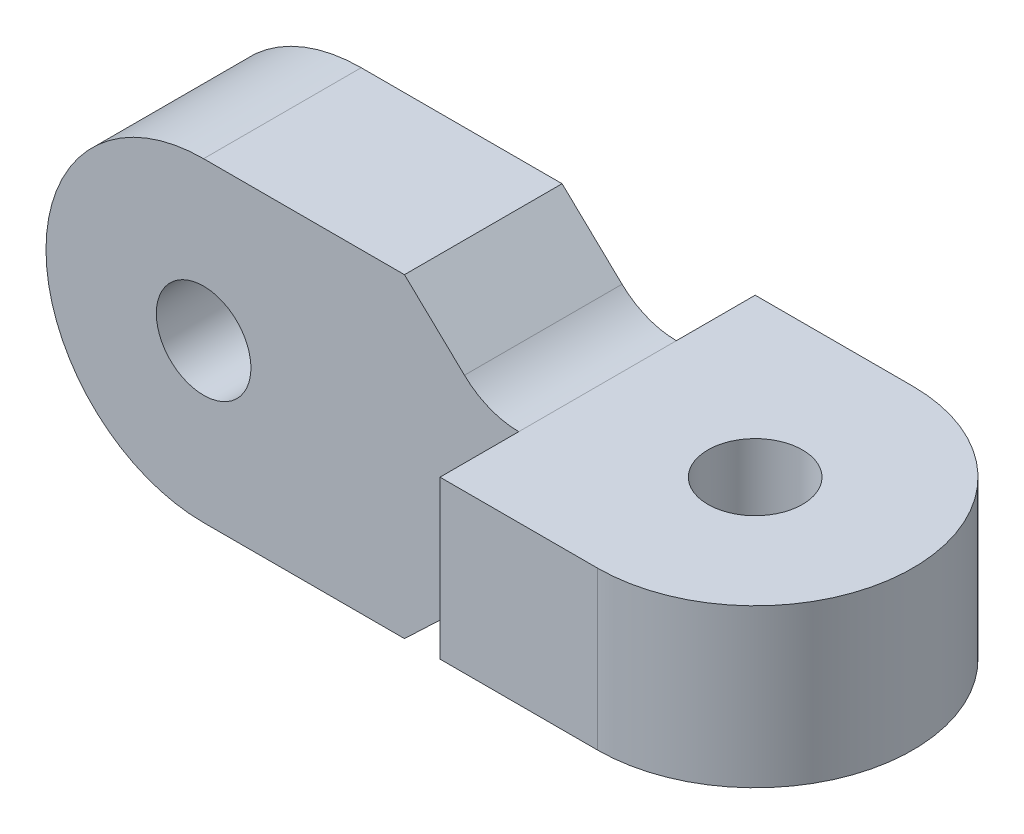
ISO-10303-21;
HEADER;
FILE_DESCRIPTION(('STEP AP214'),'2;1');
FILE_NAME('part.step','',(''),(''),'','','');
FILE_SCHEMA(('AUTOMOTIVE_DESIGN { 1 0 10303 214 1 1 1 1 }'));
ENDSEC;
DATA;
#1=APPLICATION_CONTEXT('core data for automotive mechanical design processes');
#2=APPLICATION_PROTOCOL_DEFINITION('international standard','automotive_design',2000,#1);
#3=PRODUCT_CONTEXT('',#1,'mechanical');
#4=PRODUCT('Part','Part','',(#3));
#5=PRODUCT_RELATED_PRODUCT_CATEGORY('part','',(#4));
#6=PRODUCT_DEFINITION_FORMATION('','',#4);
#7=PRODUCT_DEFINITION_CONTEXT('part definition',#1,'design');
#8=PRODUCT_DEFINITION('design','',#6,#7);
#9=PRODUCT_DEFINITION_SHAPE('','',#8);
#10=(LENGTH_UNIT() NAMED_UNIT(*) SI_UNIT(.MILLI.,.METRE.));
#11=(NAMED_UNIT(*) PLANE_ANGLE_UNIT() SI_UNIT($,.RADIAN.));
#12=(NAMED_UNIT(*) SI_UNIT($,.STERADIAN.) SOLID_ANGLE_UNIT());
#13=UNCERTAINTY_MEASURE_WITH_UNIT(LENGTH_MEASURE(1.E-05),#10,'distance_accuracy_value','');
#14=(GEOMETRIC_REPRESENTATION_CONTEXT(3) GLOBAL_UNCERTAINTY_ASSIGNED_CONTEXT((#13)) GLOBAL_UNIT_ASSIGNED_CONTEXT((#10,
#11,#12)) REPRESENTATION_CONTEXT('',''));
#15=CARTESIAN_POINT('',(0.,0.,0.));
#16=DIRECTION('',(0.,0.,1.));
#17=DIRECTION('',(1.,0.,0.));
#18=AXIS2_PLACEMENT_3D('',#15,#16,#17);
#19=CARTESIAN_POINT('',(0.,0.,10.));
#20=DIRECTION('',(0.,0.,-1.));
#21=DIRECTION('',(-1.,0.,0.));
#22=AXIS2_PLACEMENT_3D('',#19,#20,#21);
#23=PLANE('',#22);
#24=DIRECTION('',(-1.,0.,0.));
#25=VECTOR('',#24,1.);
#26=CARTESIAN_POINT('',(25.,7.5,10.));
#27=LINE('',#26,#25);
#28=CARTESIAN_POINT('',(20.,7.5,10.));
#29=VERTEX_POINT('',#28);
#30=CARTESIAN_POINT('',(15.,7.5,10.));
#31=VERTEX_POINT('',#30);
#32=EDGE_CURVE('E197',#29,#31,#27,.T.);
#33=ORIENTED_EDGE('',*,*,#32,.T.);
#34=DIRECTION('',(0.,-1.,0.));
#35=VECTOR('',#34,1.);
#36=CARTESIAN_POINT('',(15.,0.,10.));
#37=LINE('',#36,#35);
#38=CARTESIAN_POINT('',(15.,2.5,10.));
#39=VERTEX_POINT('',#38);
#40=EDGE_CURVE('E160',#31,#39,#37,.T.);
#41=ORIENTED_EDGE('',*,*,#40,.T.);
#42=DIRECTION('',(1.,0.,0.));
#43=VECTOR('',#42,1.);
#44=CARTESIAN_POINT('',(25.,2.5,10.));
#45=LINE('',#44,#43);
#46=CARTESIAN_POINT('',(20.,2.5,10.));
#47=VERTEX_POINT('',#46);
#48=EDGE_CURVE('E194',#39,#47,#45,.T.);
#49=ORIENTED_EDGE('',*,*,#48,.T.);
#50=DIRECTION('',(0.,1.,0.));
#51=VECTOR('',#50,1.);
#52=CARTESIAN_POINT('',(20.,-2.5,10.));
#53=LINE('',#52,#51);
#54=EDGE_CURVE('E179',#47,#29,#53,.T.);
#55=ORIENTED_EDGE('',*,*,#54,.T.);
#56=EDGE_LOOP('',(#33,#41,#49,#55));
#57=FACE_BOUND('',#56,.T.);
#58=ADVANCED_FACE('F32',(#57),#23,.F.);
#59=CARTESIAN_POINT('',(0.,0.,0.));
#60=DIRECTION('',(0.,0.,-1.));
#61=DIRECTION('',(-1.,0.,0.));
#62=AXIS2_PLACEMENT_3D('',#59,#60,#61);
#63=PLANE('',#62);
#64=DIRECTION('',(0.,-1.,0.));
#65=VECTOR('',#64,1.);
#66=CARTESIAN_POINT('',(15.,0.,0.));
#67=LINE('',#66,#65);
#68=CARTESIAN_POINT('',(15.,7.5,0.));
#69=VERTEX_POINT('',#68);
#70=CARTESIAN_POINT('',(15.,2.5,0.));
#71=VERTEX_POINT('',#70);
#72=EDGE_CURVE('E174',#69,#71,#67,.T.);
#73=ORIENTED_EDGE('',*,*,#72,.F.);
#74=DIRECTION('',(-1.,0.,0.));
#75=VECTOR('',#74,1.);
#76=CARTESIAN_POINT('',(25.,7.5,0.));
#77=LINE('',#76,#75);
#78=CARTESIAN_POINT('',(20.,7.5,0.));
#79=VERTEX_POINT('',#78);
#80=EDGE_CURVE('E198',#79,#69,#77,.T.);
#81=ORIENTED_EDGE('',*,*,#80,.F.);
#82=DIRECTION('',(0.,1.,0.));
#83=VECTOR('',#82,1.);
#84=CARTESIAN_POINT('',(20.,-2.5,0.));
#85=LINE('',#84,#83);
#86=CARTESIAN_POINT('',(20.,2.5,0.));
#87=VERTEX_POINT('',#86);
#88=EDGE_CURVE('E180',#87,#79,#85,.T.);
#89=ORIENTED_EDGE('',*,*,#88,.F.);
#90=DIRECTION('',(1.,0.,0.));
#91=VECTOR('',#90,1.);
#92=CARTESIAN_POINT('',(25.,2.5,0.));
#93=LINE('',#92,#91);
#94=EDGE_CURVE('E193',#71,#87,#93,.T.);
#95=ORIENTED_EDGE('',*,*,#94,.F.);
#96=EDGE_LOOP('',(#73,#81,#89,#95));
#97=FACE_BOUND('',#96,.T.);
#98=ADVANCED_FACE('F289',(#97),#63,.T.);
#99=CARTESIAN_POINT('',(0.,0.,10.));
#100=DIRECTION('',(0.,1.,0.));
#101=DIRECTION('',(0.,0.,1.));
#102=AXIS2_PLACEMENT_3D('',#99,#100,#101);
#103=PLANE('',#102);
#104=DIRECTION('',(1.,0.,0.));
#105=VECTOR('',#104,1.);
#106=CARTESIAN_POINT('',(-15.,0.,2.5));
#107=LINE('',#106,#105);
#108=CARTESIAN_POINT('',(5.,0.,2.5));
#109=VERTEX_POINT('',#108);
#110=CARTESIAN_POINT('',(11.3734309656961,0.,2.5));
#111=VERTEX_POINT('',#110);
#112=EDGE_CURVE('E141',#109,#111,#107,.T.);
#113=ORIENTED_EDGE('',*,*,#112,.T.);
#114=DIRECTION('',(0.,0.,1.));
#115=VECTOR('',#114,1.);
#116=CARTESIAN_POINT('',(11.3734309656961,0.,-2.5));
#117=LINE('',#116,#115);
#118=CARTESIAN_POINT('',(11.3734309656961,0.,7.5));
#119=VERTEX_POINT('',#118);
#120=EDGE_CURVE('E129',#111,#119,#117,.T.);
#121=ORIENTED_EDGE('',*,*,#120,.T.);
#122=DIRECTION('',(-1.,0.,0.));
#123=VECTOR('',#122,1.);
#124=CARTESIAN_POINT('',(-15.,0.,7.5));
#125=LINE('',#124,#123);
#126=CARTESIAN_POINT('',(5.,0.,7.5));
#127=VERTEX_POINT('',#126);
#128=EDGE_CURVE('E138',#119,#127,#125,.T.);
#129=ORIENTED_EDGE('',*,*,#128,.T.);
#130=DIRECTION('',(0.,0.,-1.));
#131=VECTOR('',#130,1.);
#132=CARTESIAN_POINT('',(5.,0.,10.));
#133=LINE('',#132,#131);
#134=EDGE_CURVE('E215',#127,#109,#133,.T.);
#135=ORIENTED_EDGE('',*,*,#134,.T.);
#136=EDGE_LOOP('',(#113,#121,#129,#135));
#137=FACE_BOUND('',#136,.T.);
#138=ADVANCED_FACE('F136',(#137),#103,.F.);
#139=CARTESIAN_POINT('',(25.,2.5,10.));
#140=DIRECTION('',(0.,1.,0.));
#141=DIRECTION('',(-1.,0.,0.));
#142=AXIS2_PLACEMENT_3D('',#139,#140,#141);
#143=PLANE('',#142);
#144=CARTESIAN_POINT('',(20.,2.5,5.));
#145=DIRECTION('',(0.,1.,0.));
#146=DIRECTION('',(-1.,0.,0.));
#147=AXIS2_PLACEMENT_3D('',#144,#145,#146);
#148=CIRCLE('',#147,1.5);
#149=CARTESIAN_POINT('',(18.5,2.5,5.));
#150=VERTEX_POINT('',#149);
#151=EDGE_CURVE('E190',#150,#150,#148,.T.);
#152=ORIENTED_EDGE('',*,*,#151,.T.);
#153=EDGE_LOOP('',(#152));
#154=FACE_BOUND('',#153,.T.);
#155=ORIENTED_EDGE('',*,*,#94,.T.);
#156=CARTESIAN_POINT('',(20.,2.5,5.));
#157=DIRECTION('',(0.,1.,0.));
#158=DIRECTION('',(-1.,0.,0.));
#159=AXIS2_PLACEMENT_3D('',#156,#157,#158);
#160=CIRCLE('',#159,5.);
#161=EDGE_CURVE('E183',#87,#47,#160,.F.);
#162=ORIENTED_EDGE('',*,*,#161,.T.);
#163=ORIENTED_EDGE('',*,*,#48,.F.);
#164=DIRECTION('',(0.,0.,-1.));
#165=VECTOR('',#164,1.);
#166=CARTESIAN_POINT('',(15.,2.5,10.));
#167=LINE('',#166,#165);
#168=CARTESIAN_POINT('',(15.,2.50000000000001,7.5));
#169=VERTEX_POINT('',#168);
#170=EDGE_CURVE('E210',#39,#169,#167,.T.);
#171=ORIENTED_EDGE('',*,*,#170,.T.);
#172=CARTESIAN_POINT('',(15.,2.50000000000001,2.5));
#173=VERTEX_POINT('',#172);
#174=EDGE_CURVE('E209',#169,#173,#167,.T.);
#175=ORIENTED_EDGE('',*,*,#174,.T.);
#176=DIRECTION('',(0.,0.,-1.));
#177=VECTOR('',#176,1.);
#178=CARTESIAN_POINT('',(15.,2.5,10.));
#179=LINE('',#178,#177);
#180=EDGE_CURVE('E176',#173,#71,#179,.T.);
#181=ORIENTED_EDGE('',*,*,#180,.T.);
#182=EDGE_LOOP('',(#155,#162,#163,#171,#175,#181));
#183=FACE_BOUND('',#182,.T.);
#184=ADVANCED_FACE('F261',(#154,#183),#143,.F.);
#185=CARTESIAN_POINT('',(25.,7.5,10.));
#186=DIRECTION('',(0.,-1.,0.));
#187=DIRECTION('',(0.,0.,-1.));
#188=AXIS2_PLACEMENT_3D('',#185,#186,#187);
#189=PLANE('',#188);
#190=CARTESIAN_POINT('',(20.,7.5,5.));
#191=DIRECTION('',(0.,1.,0.));
#192=DIRECTION('',(0.,0.,1.));
#193=AXIS2_PLACEMENT_3D('',#190,#191,#192);
#194=CIRCLE('',#193,1.5);
#195=CARTESIAN_POINT('',(20.,7.5,6.5));
#196=VERTEX_POINT('',#195);
#197=EDGE_CURVE('E187',#196,#196,#194,.T.);
#198=ORIENTED_EDGE('',*,*,#197,.F.);
#199=EDGE_LOOP('',(#198));
#200=FACE_BOUND('',#199,.T.);
#201=ORIENTED_EDGE('',*,*,#32,.F.);
#202=CARTESIAN_POINT('',(20.,7.5,5.));
#203=DIRECTION('',(0.,-1.,0.));
#204=DIRECTION('',(0.,0.,-1.));
#205=AXIS2_PLACEMENT_3D('',#202,#203,#204);
#206=CIRCLE('',#205,5.);
#207=EDGE_CURVE('E213',#29,#79,#206,.F.);
#208=ORIENTED_EDGE('',*,*,#207,.T.);
#209=ORIENTED_EDGE('',*,*,#80,.T.);
#210=DIRECTION('',(0.,0.,1.));
#211=VECTOR('',#210,1.);
#212=CARTESIAN_POINT('',(15.,7.5,10.));
#213=LINE('',#212,#211);
#214=CARTESIAN_POINT('',(15.,7.5,2.5));
#215=VERTEX_POINT('',#214);
#216=EDGE_CURVE('E171',#69,#215,#213,.T.);
#217=ORIENTED_EDGE('',*,*,#216,.T.);
#218=DIRECTION('',(0.,0.,-1.));
#219=VECTOR('',#218,1.);
#220=CARTESIAN_POINT('',(15.,7.5,10.));
#221=LINE('',#220,#219);
#222=CARTESIAN_POINT('',(15.,7.5,7.5));
#223=VERTEX_POINT('',#222);
#224=EDGE_CURVE('E201',#223,#215,#221,.T.);
#225=ORIENTED_EDGE('',*,*,#224,.F.);
#226=EDGE_CURVE('E206',#31,#223,#221,.T.);
#227=ORIENTED_EDGE('',*,*,#226,.F.);
#228=EDGE_LOOP('',(#201,#208,#209,#217,#225,#227));
#229=FACE_BOUND('',#228,.T.);
#230=ADVANCED_FACE('F267',(#200,#229),#189,.F.);
#231=CARTESIAN_POINT('',(0.,10.,10.));
#232=DIRECTION('',(0.,-1.,0.));
#233=DIRECTION('',(0.,0.,-1.));
#234=AXIS2_PLACEMENT_3D('',#231,#232,#233);
#235=PLANE('',#234);
#236=DIRECTION('',(-1.,0.,0.));
#237=VECTOR('',#236,1.);
#238=CARTESIAN_POINT('',(-15.,10.,7.5));
#239=LINE('',#238,#237);
#240=CARTESIAN_POINT('',(11.3734309656961,10.,7.5));
#241=VERTEX_POINT('',#240);
#242=CARTESIAN_POINT('',(5.,10.,7.5));
#243=VERTEX_POINT('',#242);
#244=EDGE_CURVE('E149',#241,#243,#239,.T.);
#245=ORIENTED_EDGE('',*,*,#244,.F.);
#246=DIRECTION('',(0.,0.,1.));
#247=VECTOR('',#246,1.);
#248=CARTESIAN_POINT('',(11.3734309656961,10.,-2.5));
#249=LINE('',#248,#247);
#250=CARTESIAN_POINT('',(11.3734309656961,10.,2.5));
#251=VERTEX_POINT('',#250);
#252=EDGE_CURVE('E55',#251,#241,#249,.T.);
#253=ORIENTED_EDGE('',*,*,#252,.F.);
#254=DIRECTION('',(1.,0.,0.));
#255=VECTOR('',#254,1.);
#256=CARTESIAN_POINT('',(-15.,10.,2.5));
#257=LINE('',#256,#255);
#258=CARTESIAN_POINT('',(5.,10.,2.5));
#259=VERTEX_POINT('',#258);
#260=EDGE_CURVE('E163',#259,#251,#257,.T.);
#261=ORIENTED_EDGE('',*,*,#260,.F.);
#262=DIRECTION('',(0.,0.,-1.));
#263=VECTOR('',#262,1.);
#264=CARTESIAN_POINT('',(5.,10.,10.));
#265=LINE('',#264,#263);
#266=EDGE_CURVE('E40',#259,#243,#265,.F.);
#267=ORIENTED_EDGE('',*,*,#266,.T.);
#268=EDGE_LOOP('',(#245,#253,#261,#267));
#269=FACE_BOUND('',#268,.T.);
#270=ADVANCED_FACE('F273',(#269),#235,.F.);
#271=CARTESIAN_POINT('',(5.,5.,10.));
#272=DIRECTION('',(0.,0.,-1.));
#273=DIRECTION('',(-1.,0.,0.));
#274=AXIS2_PLACEMENT_3D('',#271,#272,#273);
#275=CYLINDRICAL_SURFACE('',#274,1.5);
#276=CARTESIAN_POINT('',(5.,5.,7.5));
#277=DIRECTION('',(0.,0.,-1.));
#278=DIRECTION('',(-1.,0.,0.));
#279=AXIS2_PLACEMENT_3D('',#276,#277,#278);
#280=CIRCLE('',#279,1.5);
#281=CARTESIAN_POINT('',(3.5,5.,7.5));
#282=VERTEX_POINT('',#281);
#283=EDGE_CURVE('E152',#282,#282,#280,.T.);
#284=ORIENTED_EDGE('',*,*,#283,.F.);
#285=EDGE_LOOP('',(#284));
#286=FACE_BOUND('',#285,.T.);
#287=CARTESIAN_POINT('',(5.,5.,2.5));
#288=DIRECTION('',(0.,0.,1.));
#289=DIRECTION('',(1.,0.,0.));
#290=AXIS2_PLACEMENT_3D('',#287,#288,#289);
#291=CIRCLE('',#290,1.5);
#292=CARTESIAN_POINT('',(6.5,5.,2.5));
#293=VERTEX_POINT('',#292);
#294=EDGE_CURVE('E170',#293,#293,#291,.T.);
#295=ORIENTED_EDGE('',*,*,#294,.F.);
#296=EDGE_LOOP('',(#295));
#297=FACE_BOUND('',#296,.T.);
#298=ADVANCED_FACE('F297',(#286,#297),#275,.F.);
#299=CARTESIAN_POINT('',(20.,-2.5,5.));
#300=DIRECTION('',(0.,1.,0.));
#301=DIRECTION('',(0.,0.,1.));
#302=AXIS2_PLACEMENT_3D('',#299,#300,#301);
#303=CYLINDRICAL_SURFACE('',#302,1.5);
#304=ORIENTED_EDGE('',*,*,#197,.T.);
#305=EDGE_LOOP('',(#304));
#306=FACE_BOUND('',#305,.T.);
#307=ORIENTED_EDGE('',*,*,#151,.F.);
#308=EDGE_LOOP('',(#307));
#309=FACE_BOUND('',#308,.T.);
#310=ADVANCED_FACE('F331',(#306,#309),#303,.F.);
#311=CARTESIAN_POINT('',(20.,-2.5,5.));
#312=DIRECTION('',(0.,1.,0.));
#313=DIRECTION('',(0.,0.,1.));
#314=AXIS2_PLACEMENT_3D('',#311,#312,#313);
#315=CYLINDRICAL_SURFACE('',#314,5.);
#316=ORIENTED_EDGE('',*,*,#88,.T.);
#317=ORIENTED_EDGE('',*,*,#207,.F.);
#318=ORIENTED_EDGE('',*,*,#54,.F.);
#319=ORIENTED_EDGE('',*,*,#161,.F.);
#320=EDGE_LOOP('',(#316,#317,#318,#319));
#321=FACE_BOUND('',#320,.T.);
#322=ADVANCED_FACE('F339',(#321),#315,.T.);
#323=CARTESIAN_POINT('',(15.,0.,2.5));
#324=DIRECTION('',(1.,0.,0.));
#325=DIRECTION('',(0.,0.,-1.));
#326=AXIS2_PLACEMENT_3D('',#323,#324,#325);
#327=PLANE('',#326);
#328=DIRECTION('',(0.,1.,0.));
#329=VECTOR('',#328,1.);
#330=CARTESIAN_POINT('',(15.,0.,2.5));
#331=LINE('',#330,#329);
#332=EDGE_CURVE('E165',#173,#215,#331,.T.);
#333=ORIENTED_EDGE('',*,*,#332,.T.);
#334=ORIENTED_EDGE('',*,*,#216,.F.);
#335=ORIENTED_EDGE('',*,*,#72,.T.);
#336=ORIENTED_EDGE('',*,*,#180,.F.);
#337=EDGE_LOOP('',(#333,#334,#335,#336));
#338=FACE_BOUND('',#337,.T.);
#339=ADVANCED_FACE('F346',(#338),#327,.F.);
#340=CARTESIAN_POINT('',(-15.,0.,2.5));
#341=DIRECTION('',(0.,0.,1.));
#342=DIRECTION('',(1.,0.,0.));
#343=AXIS2_PLACEMENT_3D('',#340,#341,#342);
#344=PLANE('',#343);
#345=ORIENTED_EDGE('',*,*,#294,.T.);
#346=EDGE_LOOP('',(#345));
#347=FACE_BOUND('',#346,.T.);
#348=ORIENTED_EDGE('',*,*,#332,.F.);
#349=CARTESIAN_POINT('',(15.,0.,2.5));
#350=DIRECTION('',(0.,0.,1.));
#351=DIRECTION('',(1.,0.,0.));
#352=AXIS2_PLACEMENT_3D('',#349,#350,#351);
#353=CIRCLE('',#352,2.50000000000001);
#354=CARTESIAN_POINT('',(13.2766080168664,1.8110549611954,2.5));
#355=VERTEX_POINT('',#354);
#356=EDGE_CURVE('E245',#173,#355,#353,.T.);
#357=ORIENTED_EDGE('',*,*,#356,.T.);
#358=DIRECTION('',(-0.724421984478188,-0.689356793253453,0.));
#359=VECTOR('',#358,1.);
#360=CARTESIAN_POINT('',(-2.46700833099307,-13.1705015242702,2.5));
#361=LINE('',#360,#359);
#362=EDGE_CURVE('E142',#355,#111,#361,.T.);
#363=ORIENTED_EDGE('',*,*,#362,.T.);
#364=ORIENTED_EDGE('',*,*,#112,.F.);
#365=CARTESIAN_POINT('',(5.,5.,2.5));
#366=DIRECTION('',(0.,0.,1.));
#367=DIRECTION('',(1.,0.,0.));
#368=AXIS2_PLACEMENT_3D('',#365,#366,#367);
#369=CIRCLE('',#368,5.);
#370=CARTESIAN_POINT('',(0.,5.,2.5));
#371=VERTEX_POINT('',#370);
#372=EDGE_CURVE('E223',#109,#371,#369,.F.);
#373=ORIENTED_EDGE('',*,*,#372,.T.);
#374=CARTESIAN_POINT('',(5.,5.,2.5));
#375=DIRECTION('',(0.,0.,1.));
#376=DIRECTION('',(1.,0.,0.));
#377=AXIS2_PLACEMENT_3D('',#374,#375,#376);
#378=CIRCLE('',#377,5.);
#379=EDGE_CURVE('E221',#371,#259,#378,.F.);
#380=ORIENTED_EDGE('',*,*,#379,.T.);
#381=ORIENTED_EDGE('',*,*,#260,.T.);
#382=DIRECTION('',(0.724421984478188,-0.689356793253453,0.));
#383=VECTOR('',#382,1.);
#384=CARTESIAN_POINT('',(2.52684383082876,18.4183736402233,2.5));
#385=LINE('',#384,#383);
#386=CARTESIAN_POINT('',(13.2766080168664,8.18894503880453,2.5));
#387=VERTEX_POINT('',#386);
#388=EDGE_CURVE('E233',#251,#387,#385,.T.);
#389=ORIENTED_EDGE('',*,*,#388,.T.);
#390=CARTESIAN_POINT('',(15.,10.,2.5));
#391=DIRECTION('',(0.,0.,1.));
#392=DIRECTION('',(1.,0.,0.));
#393=AXIS2_PLACEMENT_3D('',#390,#391,#392);
#394=CIRCLE('',#393,2.5);
#395=EDGE_CURVE('E157',#387,#215,#394,.T.);
#396=ORIENTED_EDGE('',*,*,#395,.T.);
#397=EDGE_LOOP('',(#348,#357,#363,#364,#373,#380,#381,#389,#396));
#398=FACE_BOUND('',#397,.T.);
#399=ADVANCED_FACE('F249',(#347,#398),#344,.F.);
#400=CARTESIAN_POINT('',(15.,0.,12.9541395212886));
#401=DIRECTION('',(1.,0.,0.));
#402=DIRECTION('',(0.,0.,-1.));
#403=AXIS2_PLACEMENT_3D('',#400,#401,#402);
#404=PLANE('',#403);
#405=ORIENTED_EDGE('',*,*,#40,.F.);
#406=ORIENTED_EDGE('',*,*,#226,.T.);
#407=DIRECTION('',(0.,1.,0.));
#408=VECTOR('',#407,1.);
#409=CARTESIAN_POINT('',(15.,0.,7.5));
#410=LINE('',#409,#408);
#411=EDGE_CURVE('E148',#169,#223,#410,.T.);
#412=ORIENTED_EDGE('',*,*,#411,.F.);
#413=ORIENTED_EDGE('',*,*,#170,.F.);
#414=EDGE_LOOP('',(#405,#406,#412,#413));
#415=FACE_BOUND('',#414,.T.);
#416=ADVANCED_FACE('F257',(#415),#404,.F.);
#417=CARTESIAN_POINT('',(-15.,0.,7.5));
#418=DIRECTION('',(0.,0.,-1.));
#419=DIRECTION('',(-1.,0.,0.));
#420=AXIS2_PLACEMENT_3D('',#417,#418,#419);
#421=PLANE('',#420);
#422=ORIENTED_EDGE('',*,*,#283,.T.);
#423=EDGE_LOOP('',(#422));
#424=FACE_BOUND('',#423,.T.);
#425=DIRECTION('',(-0.724421984478188,-0.689356793253453,0.));
#426=VECTOR('',#425,1.);
#427=CARTESIAN_POINT('',(13.2766080168664,1.8110549611954,7.5));
#428=LINE('',#427,#426);
#429=CARTESIAN_POINT('',(13.2766080168664,1.8110549611954,7.5));
#430=VERTEX_POINT('',#429);
#431=EDGE_CURVE('E126',#430,#119,#428,.T.);
#432=ORIENTED_EDGE('',*,*,#431,.F.);
#433=CARTESIAN_POINT('',(15.,0.,7.5));
#434=DIRECTION('',(0.,0.,-1.));
#435=DIRECTION('',(-1.,0.,0.));
#436=AXIS2_PLACEMENT_3D('',#433,#434,#435);
#437=CIRCLE('',#436,2.50000000000001);
#438=EDGE_CURVE('E11',#430,#169,#437,.T.);
#439=ORIENTED_EDGE('',*,*,#438,.T.);
#440=ORIENTED_EDGE('',*,*,#411,.T.);
#441=CARTESIAN_POINT('',(15.,10.,7.5));
#442=DIRECTION('',(0.,0.,1.));
#443=DIRECTION('',(1.,0.,0.));
#444=AXIS2_PLACEMENT_3D('',#441,#442,#443);
#445=CIRCLE('',#444,2.5);
#446=CARTESIAN_POINT('',(13.2766080168664,8.18894503880453,7.5));
#447=VERTEX_POINT('',#446);
#448=EDGE_CURVE('E243',#447,#223,#445,.T.);
#449=ORIENTED_EDGE('',*,*,#448,.F.);
#450=DIRECTION('',(0.724421984478188,-0.689356793253453,0.));
#451=VECTOR('',#450,1.);
#452=CARTESIAN_POINT('',(13.2766080168664,8.18894503880453,7.5));
#453=LINE('',#452,#451);
#454=EDGE_CURVE('E240',#241,#447,#453,.T.);
#455=ORIENTED_EDGE('',*,*,#454,.F.);
#456=ORIENTED_EDGE('',*,*,#244,.T.);
#457=CARTESIAN_POINT('',(5.,5.,7.5));
#458=DIRECTION('',(0.,0.,-1.));
#459=DIRECTION('',(-1.,0.,0.));
#460=AXIS2_PLACEMENT_3D('',#457,#458,#459);
#461=CIRCLE('',#460,5.);
#462=CARTESIAN_POINT('',(0.,5.,7.5));
#463=VERTEX_POINT('',#462);
#464=EDGE_CURVE('E225',#243,#463,#461,.F.);
#465=ORIENTED_EDGE('',*,*,#464,.T.);
#466=CARTESIAN_POINT('',(5.,5.,7.5));
#467=DIRECTION('',(0.,0.,-1.));
#468=DIRECTION('',(-1.,0.,0.));
#469=AXIS2_PLACEMENT_3D('',#466,#467,#468);
#470=CIRCLE('',#469,5.);
#471=EDGE_CURVE('E146',#463,#127,#470,.F.);
#472=ORIENTED_EDGE('',*,*,#471,.T.);
#473=ORIENTED_EDGE('',*,*,#128,.F.);
#474=EDGE_LOOP('',(#432,#439,#440,#449,#455,#456,#465,#472,#473));
#475=FACE_BOUND('',#474,.T.);
#476=ADVANCED_FACE('F144',(#424,#475),#421,.F.);
#477=CARTESIAN_POINT('',(5.,5.,10.));
#478=DIRECTION('',(0.,0.,-1.));
#479=DIRECTION('',(-1.,0.,0.));
#480=AXIS2_PLACEMENT_3D('',#477,#478,#479);
#481=CYLINDRICAL_SURFACE('',#480,5.);
#482=DIRECTION('',(0.,0.,-1.));
#483=VECTOR('',#482,1.);
#484=CARTESIAN_POINT('',(0.,5.,10.));
#485=LINE('',#484,#483);
#486=EDGE_CURVE('E154',#463,#371,#485,.T.);
#487=ORIENTED_EDGE('',*,*,#486,.F.);
#488=ORIENTED_EDGE('',*,*,#464,.F.);
#489=ORIENTED_EDGE('',*,*,#266,.F.);
#490=ORIENTED_EDGE('',*,*,#379,.F.);
#491=EDGE_LOOP('',(#487,#488,#489,#490));
#492=FACE_BOUND('',#491,.T.);
#493=ADVANCED_FACE('F34',(#492),#481,.T.);
#494=CARTESIAN_POINT('',(5.,5.,10.));
#495=DIRECTION('',(0.,0.,-1.));
#496=DIRECTION('',(-1.,0.,0.));
#497=AXIS2_PLACEMENT_3D('',#494,#495,#496);
#498=CYLINDRICAL_SURFACE('',#497,5.);
#499=ORIENTED_EDGE('',*,*,#471,.F.);
#500=ORIENTED_EDGE('',*,*,#486,.T.);
#501=ORIENTED_EDGE('',*,*,#372,.F.);
#502=ORIENTED_EDGE('',*,*,#134,.F.);
#503=EDGE_LOOP('',(#499,#500,#501,#502));
#504=FACE_BOUND('',#503,.T.);
#505=ADVANCED_FACE('F279',(#504),#498,.T.);
#506=CARTESIAN_POINT('',(15.,10.,-2.5));
#507=DIRECTION('',(0.,0.,1.));
#508=DIRECTION('',(1.,0.,0.));
#509=AXIS2_PLACEMENT_3D('',#506,#507,#508);
#510=CYLINDRICAL_SURFACE('',#509,2.5);
#511=ORIENTED_EDGE('',*,*,#395,.F.);
#512=DIRECTION('',(0.,0.,1.));
#513=VECTOR('',#512,1.);
#514=CARTESIAN_POINT('',(13.2766080168664,8.18894503880453,-2.5));
#515=LINE('',#514,#513);
#516=EDGE_CURVE('E237',#387,#447,#515,.T.);
#517=ORIENTED_EDGE('',*,*,#516,.T.);
#518=ORIENTED_EDGE('',*,*,#448,.T.);
#519=ORIENTED_EDGE('',*,*,#224,.T.);
#520=EDGE_LOOP('',(#511,#517,#518,#519));
#521=FACE_BOUND('',#520,.T.);
#522=ADVANCED_FACE('F269',(#521),#510,.F.);
#523=CARTESIAN_POINT('',(13.2766080168664,8.18894503880453,-2.5));
#524=DIRECTION('',(-0.689356793253453,-0.724421984478188,0.));
#525=DIRECTION('',(0.724421984478188,-0.689356793253453,0.));
#526=AXIS2_PLACEMENT_3D('',#523,#524,#525);
#527=PLANE('',#526);
#528=ORIENTED_EDGE('',*,*,#252,.T.);
#529=ORIENTED_EDGE('',*,*,#454,.T.);
#530=ORIENTED_EDGE('',*,*,#516,.F.);
#531=ORIENTED_EDGE('',*,*,#388,.F.);
#532=EDGE_LOOP('',(#528,#529,#530,#531));
#533=FACE_BOUND('',#532,.T.);
#534=ADVANCED_FACE('F285',(#533),#527,.F.);
#535=CARTESIAN_POINT('',(15.,0.,-2.5));
#536=DIRECTION('',(0.,0.,1.));
#537=DIRECTION('',(1.,0.,0.));
#538=AXIS2_PLACEMENT_3D('',#535,#536,#537);
#539=CYLINDRICAL_SURFACE('',#538,2.50000000000001);
#540=ORIENTED_EDGE('',*,*,#438,.F.);
#541=DIRECTION('',(0.,0.,1.));
#542=VECTOR('',#541,1.);
#543=CARTESIAN_POINT('',(13.2766080168664,1.8110549611954,-2.5));
#544=LINE('',#543,#542);
#545=EDGE_CURVE('E47',#355,#430,#544,.T.);
#546=ORIENTED_EDGE('',*,*,#545,.F.);
#547=ORIENTED_EDGE('',*,*,#356,.F.);
#548=ORIENTED_EDGE('',*,*,#174,.F.);
#549=EDGE_LOOP('',(#540,#546,#547,#548));
#550=FACE_BOUND('',#549,.T.);
#551=ADVANCED_FACE('F251',(#550),#539,.F.);
#552=CARTESIAN_POINT('',(13.2766080168664,1.8110549611954,-2.5));
#553=DIRECTION('',(-0.689356793253453,0.724421984478188,0.));
#554=DIRECTION('',(-0.724421984478188,-0.689356793253453,0.));
#555=AXIS2_PLACEMENT_3D('',#552,#553,#554);
#556=PLANE('',#555);
#557=ORIENTED_EDGE('',*,*,#545,.T.);
#558=ORIENTED_EDGE('',*,*,#431,.T.);
#559=ORIENTED_EDGE('',*,*,#120,.F.);
#560=ORIENTED_EDGE('',*,*,#362,.F.);
#561=EDGE_LOOP('',(#557,#558,#559,#560));
#562=FACE_BOUND('',#561,.T.);
#563=ADVANCED_FACE('F128',(#562),#556,.F.);
#564=CLOSED_SHELL('',(#58,#98,#138,#184,#230,#270,#298,#310,#322,#339,#399,#416,#476,#493,#505,
#522,#534,#551,#563));
#565=MANIFOLD_SOLID_BREP('B2',#564);
#566=ADVANCED_BREP_SHAPE_REPRESENTATION('',(#18,#565),#14);
#567=SHAPE_DEFINITION_REPRESENTATION(#9,#566);
ENDSEC;
END-ISO-10303-21;
